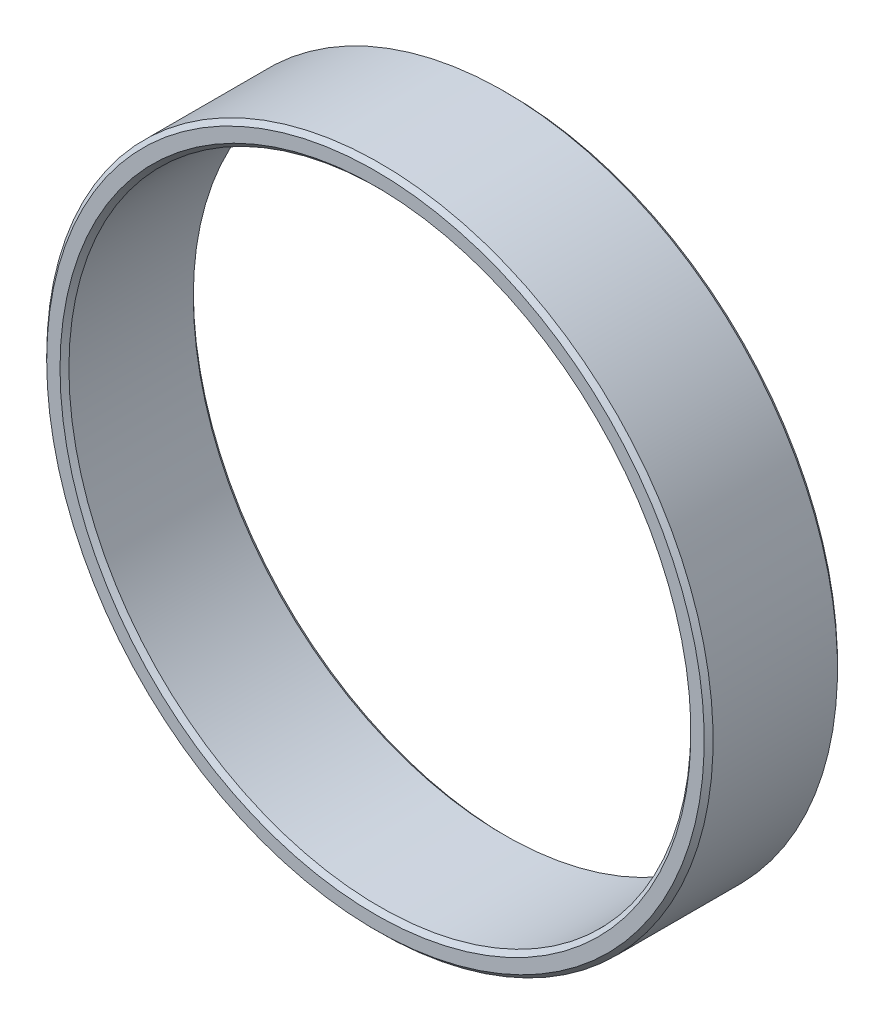
ISO-10303-21;
HEADER;
FILE_DESCRIPTION(('STEP AP214'),'2;1');
FILE_NAME('part.step','',(''),(''),'','','');
FILE_SCHEMA(('AUTOMOTIVE_DESIGN { 1 0 10303 214 1 1 1 1 }'));
ENDSEC;
DATA;
#1=APPLICATION_CONTEXT('core data for automotive mechanical design processes');
#2=APPLICATION_PROTOCOL_DEFINITION('international standard','automotive_design',2000,#1);
#3=PRODUCT_CONTEXT('',#1,'mechanical');
#4=PRODUCT('Part','Part','',(#3));
#5=PRODUCT_RELATED_PRODUCT_CATEGORY('part','',(#4));
#6=PRODUCT_DEFINITION_FORMATION('','',#4);
#7=PRODUCT_DEFINITION_CONTEXT('part definition',#1,'design');
#8=PRODUCT_DEFINITION('design','',#6,#7);
#9=PRODUCT_DEFINITION_SHAPE('','',#8);
#10=(LENGTH_UNIT() NAMED_UNIT(*) SI_UNIT(.MILLI.,.METRE.));
#11=(NAMED_UNIT(*) PLANE_ANGLE_UNIT() SI_UNIT($,.RADIAN.));
#12=(NAMED_UNIT(*) SI_UNIT($,.STERADIAN.) SOLID_ANGLE_UNIT());
#13=UNCERTAINTY_MEASURE_WITH_UNIT(LENGTH_MEASURE(1.E-05),#10,'distance_accuracy_value','');
#14=(GEOMETRIC_REPRESENTATION_CONTEXT(3) GLOBAL_UNCERTAINTY_ASSIGNED_CONTEXT((#13)) GLOBAL_UNIT_ASSIGNED_CONTEXT((#10,
#11,#12)) REPRESENTATION_CONTEXT('',''));
#15=CARTESIAN_POINT('',(0.,0.,0.));
#16=DIRECTION('',(0.,0.,1.));
#17=DIRECTION('',(1.,0.,0.));
#18=AXIS2_PLACEMENT_3D('',#15,#16,#17);
#19=CARTESIAN_POINT('',(0.,0.,0.));
#20=DIRECTION('',(0.,0.,-1.));
#21=DIRECTION('',(-1.,0.,0.));
#22=AXIS2_PLACEMENT_3D('',#19,#20,#21);
#23=CYLINDRICAL_SURFACE('',#22,37.5);
#24=CARTESIAN_POINT('',(0.,0.,35.4044488623992));
#25=DIRECTION('',(0.,0.,-1.));
#26=DIRECTION('',(-1.,0.,0.));
#27=AXIS2_PLACEMENT_3D('',#24,#25,#26);
#28=CIRCLE('',#27,37.5);
#29=CARTESIAN_POINT('',(-37.5,0.,35.4044488623992));
#30=VERTEX_POINT('',#29);
#31=EDGE_CURVE('E72',#30,#30,#28,.T.);
#32=ORIENTED_EDGE('',*,*,#31,.T.);
#33=EDGE_LOOP('',(#32));
#34=FACE_BOUND('',#33,.T.);
#35=CARTESIAN_POINT('',(0.,0.,21.4044488623992));
#36=DIRECTION('',(0.,0.,-1.));
#37=DIRECTION('',(-1.,0.,0.));
#38=AXIS2_PLACEMENT_3D('',#35,#36,#37);
#39=CIRCLE('',#38,37.5);
#40=CARTESIAN_POINT('',(-37.5,0.,21.4044488623992));
#41=VERTEX_POINT('',#40);
#42=EDGE_CURVE('E10',#41,#41,#39,.T.);
#43=ORIENTED_EDGE('',*,*,#42,.F.);
#44=EDGE_LOOP('',(#43));
#45=FACE_BOUND('',#44,.T.);
#46=ADVANCED_FACE('F37',(#34,#45),#23,.T.);
#47=CARTESIAN_POINT('',(0.,0.,20.9044488623992));
#48=DIRECTION('',(0.,0.,1.));
#49=DIRECTION('',(1.,0.,0.));
#50=AXIS2_PLACEMENT_3D('',#47,#48,#49);
#51=CONICAL_SURFACE('',#50,37.,0.785398163397448);
#52=ORIENTED_EDGE('',*,*,#42,.T.);
#53=EDGE_LOOP('',(#52));
#54=FACE_BOUND('',#53,.T.);
#55=CARTESIAN_POINT('',(0.,0.,20.9044488623992));
#56=DIRECTION('',(0.,0.,-1.));
#57=DIRECTION('',(-1.,0.,0.));
#58=AXIS2_PLACEMENT_3D('',#55,#56,#57);
#59=CIRCLE('',#58,37.);
#60=CARTESIAN_POINT('',(-37.,0.,20.9044488623992));
#61=VERTEX_POINT('',#60);
#62=EDGE_CURVE('E44',#61,#61,#59,.T.);
#63=ORIENTED_EDGE('',*,*,#62,.F.);
#64=EDGE_LOOP('',(#63));
#65=FACE_BOUND('',#64,.T.);
#66=ADVANCED_FACE('F91',(#54,#65),#51,.T.);
#67=CARTESIAN_POINT('',(0.,37.,20.9044488623992));
#68=DIRECTION('',(0.,0.,-1.));
#69=DIRECTION('',(-1.,0.,0.));
#70=AXIS2_PLACEMENT_3D('',#67,#68,#69);
#71=PLANE('',#70);
#72=ORIENTED_EDGE('',*,*,#62,.T.);
#73=EDGE_LOOP('',(#72));
#74=FACE_BOUND('',#73,.T.);
#75=CARTESIAN_POINT('',(0.,0.,20.9044488623992));
#76=DIRECTION('',(0.,0.,-1.));
#77=DIRECTION('',(-1.,0.,0.));
#78=AXIS2_PLACEMENT_3D('',#75,#76,#77);
#79=CIRCLE('',#78,35.5);
#80=CARTESIAN_POINT('',(-35.5,0.,20.9044488623992));
#81=VERTEX_POINT('',#80);
#82=EDGE_CURVE('E49',#81,#81,#79,.T.);
#83=ORIENTED_EDGE('',*,*,#82,.F.);
#84=EDGE_LOOP('',(#83));
#85=FACE_BOUND('',#84,.T.);
#86=ADVANCED_FACE('F95',(#74,#85),#71,.T.);
#87=CARTESIAN_POINT('',(0.,0.,21.4044488623992));
#88=DIRECTION('',(0.,0.,-1.));
#89=DIRECTION('',(-1.,0.,0.));
#90=AXIS2_PLACEMENT_3D('',#87,#88,#89);
#91=CONICAL_SURFACE('',#90,35.,0.785398163397448);
#92=ORIENTED_EDGE('',*,*,#82,.T.);
#93=EDGE_LOOP('',(#92));
#94=FACE_BOUND('',#93,.T.);
#95=CARTESIAN_POINT('',(0.,0.,21.4044488623992));
#96=DIRECTION('',(0.,0.,-1.));
#97=DIRECTION('',(-1.,0.,0.));
#98=AXIS2_PLACEMENT_3D('',#95,#96,#97);
#99=CIRCLE('',#98,35.);
#100=CARTESIAN_POINT('',(-35.,0.,21.4044488623992));
#101=VERTEX_POINT('',#100);
#102=EDGE_CURVE('E54',#101,#101,#99,.T.);
#103=ORIENTED_EDGE('',*,*,#102,.F.);
#104=EDGE_LOOP('',(#103));
#105=FACE_BOUND('',#104,.T.);
#106=ADVANCED_FACE('F99',(#94,#105),#91,.F.);
#107=CARTESIAN_POINT('',(0.,0.,0.));
#108=DIRECTION('',(0.,0.,-1.));
#109=DIRECTION('',(-1.,0.,0.));
#110=AXIS2_PLACEMENT_3D('',#107,#108,#109);
#111=CYLINDRICAL_SURFACE('',#110,35.);
#112=ORIENTED_EDGE('',*,*,#102,.T.);
#113=EDGE_LOOP('',(#112));
#114=FACE_BOUND('',#113,.T.);
#115=CARTESIAN_POINT('',(0.,0.,35.4044488623992));
#116=DIRECTION('',(0.,0.,-1.));
#117=DIRECTION('',(-1.,0.,0.));
#118=AXIS2_PLACEMENT_3D('',#115,#116,#117);
#119=CIRCLE('',#118,35.);
#120=CARTESIAN_POINT('',(-35.,0.,35.4044488623992));
#121=VERTEX_POINT('',#120);
#122=EDGE_CURVE('E60',#121,#121,#119,.T.);
#123=ORIENTED_EDGE('',*,*,#122,.F.);
#124=EDGE_LOOP('',(#123));
#125=FACE_BOUND('',#124,.T.);
#126=ADVANCED_FACE('F105',(#114,#125),#111,.F.);
#127=CARTESIAN_POINT('',(0.,0.,35.9044488623992));
#128=DIRECTION('',(0.,0.,1.));
#129=DIRECTION('',(1.,0.,0.));
#130=AXIS2_PLACEMENT_3D('',#127,#128,#129);
#131=CONICAL_SURFACE('',#130,35.5,0.785398163397448);
#132=ORIENTED_EDGE('',*,*,#122,.T.);
#133=EDGE_LOOP('',(#132));
#134=FACE_BOUND('',#133,.T.);
#135=CARTESIAN_POINT('',(0.,0.,35.9044488623992));
#136=DIRECTION('',(0.,0.,-1.));
#137=DIRECTION('',(-1.,0.,0.));
#138=AXIS2_PLACEMENT_3D('',#135,#136,#137);
#139=CIRCLE('',#138,35.5);
#140=CARTESIAN_POINT('',(-35.5,0.,35.9044488623992));
#141=VERTEX_POINT('',#140);
#142=EDGE_CURVE('E64',#141,#141,#139,.T.);
#143=ORIENTED_EDGE('',*,*,#142,.F.);
#144=EDGE_LOOP('',(#143));
#145=FACE_BOUND('',#144,.T.);
#146=ADVANCED_FACE('F87',(#134,#145),#131,.F.);
#147=CARTESIAN_POINT('',(0.,37.,35.9044488623992));
#148=DIRECTION('',(0.,0.,1.));
#149=DIRECTION('',(1.,0.,0.));
#150=AXIS2_PLACEMENT_3D('',#147,#148,#149);
#151=PLANE('',#150);
#152=ORIENTED_EDGE('',*,*,#142,.T.);
#153=EDGE_LOOP('',(#152));
#154=FACE_BOUND('',#153,.T.);
#155=CARTESIAN_POINT('',(0.,0.,35.9044488623992));
#156=DIRECTION('',(0.,0.,-1.));
#157=DIRECTION('',(-1.,0.,0.));
#158=AXIS2_PLACEMENT_3D('',#155,#156,#157);
#159=CIRCLE('',#158,37.);
#160=CARTESIAN_POINT('',(-37.,0.,35.9044488623992));
#161=VERTEX_POINT('',#160);
#162=EDGE_CURVE('E68',#161,#161,#159,.T.);
#163=ORIENTED_EDGE('',*,*,#162,.F.);
#164=EDGE_LOOP('',(#163));
#165=FACE_BOUND('',#164,.T.);
#166=ADVANCED_FACE('F81',(#154,#165),#151,.T.);
#167=CARTESIAN_POINT('',(0.,0.,35.4044488623992));
#168=DIRECTION('',(0.,0.,-1.));
#169=DIRECTION('',(-1.,0.,0.));
#170=AXIS2_PLACEMENT_3D('',#167,#168,#169);
#171=CONICAL_SURFACE('',#170,37.5,0.785398163397448);
#172=ORIENTED_EDGE('',*,*,#162,.T.);
#173=EDGE_LOOP('',(#172));
#174=FACE_BOUND('',#173,.T.);
#175=ORIENTED_EDGE('',*,*,#31,.F.);
#176=EDGE_LOOP('',(#175));
#177=FACE_BOUND('',#176,.T.);
#178=ADVANCED_FACE('F79',(#174,#177),#171,.T.);
#179=CLOSED_SHELL('',(#46,#66,#86,#106,#126,#146,#166,#178));
#180=MANIFOLD_SOLID_BREP('B2',#179);
#181=ADVANCED_BREP_SHAPE_REPRESENTATION('',(#18,#180),#14);
#182=SHAPE_DEFINITION_REPRESENTATION(#9,#181);
ENDSEC;
END-ISO-10303-21;
